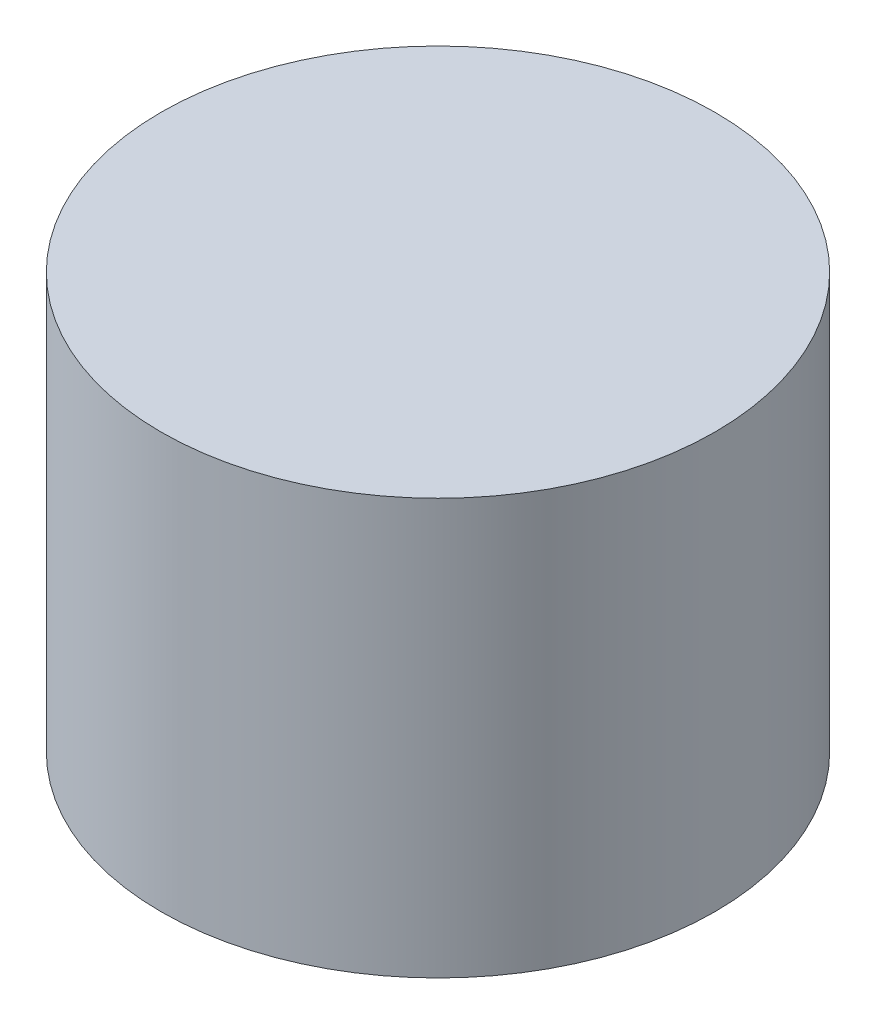
ISO-10303-21;
HEADER;
FILE_DESCRIPTION(('STEP AP214'),'2;1');
FILE_NAME('part.step','',(''),(''),'','','');
FILE_SCHEMA(('AUTOMOTIVE_DESIGN { 1 0 10303 214 1 1 1 1 }'));
ENDSEC;
DATA;
#1=APPLICATION_CONTEXT('core data for automotive mechanical design processes');
#2=APPLICATION_PROTOCOL_DEFINITION('international standard','automotive_design',2000,#1);
#3=PRODUCT_CONTEXT('',#1,'mechanical');
#4=PRODUCT('Part','Part','',(#3));
#5=PRODUCT_RELATED_PRODUCT_CATEGORY('part','',(#4));
#6=PRODUCT_DEFINITION_FORMATION('','',#4);
#7=PRODUCT_DEFINITION_CONTEXT('part definition',#1,'design');
#8=PRODUCT_DEFINITION('design','',#6,#7);
#9=PRODUCT_DEFINITION_SHAPE('','',#8);
#10=(LENGTH_UNIT() NAMED_UNIT(*) SI_UNIT(.MILLI.,.METRE.));
#11=(NAMED_UNIT(*) PLANE_ANGLE_UNIT() SI_UNIT($,.RADIAN.));
#12=(NAMED_UNIT(*) SI_UNIT($,.STERADIAN.) SOLID_ANGLE_UNIT());
#13=UNCERTAINTY_MEASURE_WITH_UNIT(LENGTH_MEASURE(1.E-05),#10,'distance_accuracy_value','');
#14=(GEOMETRIC_REPRESENTATION_CONTEXT(3) GLOBAL_UNCERTAINTY_ASSIGNED_CONTEXT((#13)) GLOBAL_UNIT_ASSIGNED_CONTEXT((#10,
#11,#12)) REPRESENTATION_CONTEXT('',''));
#15=CARTESIAN_POINT('',(0.,0.,0.));
#16=DIRECTION('',(0.,0.,1.));
#17=DIRECTION('',(1.,0.,0.));
#18=AXIS2_PLACEMENT_3D('',#15,#16,#17);
#19=CARTESIAN_POINT('',(0.,7.5,0.));
#20=DIRECTION('',(0.,-1.,0.));
#21=DIRECTION('',(0.,0.,-1.));
#22=AXIS2_PLACEMENT_3D('',#19,#20,#21);
#23=CYLINDRICAL_SURFACE('',#22,10.);
#24=CARTESIAN_POINT('',(0.,7.5,0.));
#25=DIRECTION('',(0.,1.,0.));
#26=DIRECTION('',(0.,0.,1.));
#27=AXIS2_PLACEMENT_3D('',#24,#25,#26);
#28=CIRCLE('',#27,10.);
#29=CARTESIAN_POINT('',(0.,7.5,10.));
#30=VERTEX_POINT('',#29);
#31=EDGE_CURVE('E10',#30,#30,#28,.T.);
#32=ORIENTED_EDGE('',*,*,#31,.F.);
#33=EDGE_LOOP('',(#32));
#34=FACE_BOUND('',#33,.T.);
#35=CARTESIAN_POINT('',(0.,-7.5,0.));
#36=DIRECTION('',(0.,1.,0.));
#37=DIRECTION('',(0.,0.,1.));
#38=AXIS2_PLACEMENT_3D('',#35,#36,#37);
#39=CIRCLE('',#38,10.);
#40=CARTESIAN_POINT('',(0.,-7.5,10.));
#41=VERTEX_POINT('',#40);
#42=EDGE_CURVE('E43',#41,#41,#39,.T.);
#43=ORIENTED_EDGE('',*,*,#42,.T.);
#44=EDGE_LOOP('',(#43));
#45=FACE_BOUND('',#44,.T.);
#46=ADVANCED_FACE('F40',(#34,#45),#23,.T.);
#47=CARTESIAN_POINT('',(0.,7.5,0.));
#48=DIRECTION('',(0.,1.,0.));
#49=DIRECTION('',(0.,0.,1.));
#50=AXIS2_PLACEMENT_3D('',#47,#48,#49);
#51=PLANE('',#50);
#52=ORIENTED_EDGE('',*,*,#31,.T.);
#53=EDGE_LOOP('',(#52));
#54=FACE_BOUND('',#53,.T.);
#55=ADVANCED_FACE('F73',(#54),#51,.T.);
#56=CARTESIAN_POINT('',(0.,-7.5,0.));
#57=DIRECTION('',(0.,1.,0.));
#58=DIRECTION('',(0.,0.,1.));
#59=AXIS2_PLACEMENT_3D('',#56,#57,#58);
#60=PLANE('',#59);
#61=CARTESIAN_POINT('',(0.,-7.5,0.));
#62=DIRECTION('',(0.,-1.,0.));
#63=DIRECTION('',(0.,0.,-1.));
#64=AXIS2_PLACEMENT_3D('',#61,#62,#63);
#65=CIRCLE('',#64,2.);
#66=CARTESIAN_POINT('',(0.,-7.5,-2.));
#67=VERTEX_POINT('',#66);
#68=EDGE_CURVE('E54',#67,#67,#65,.T.);
#69=ORIENTED_EDGE('',*,*,#68,.F.);
#70=EDGE_LOOP('',(#69));
#71=FACE_BOUND('',#70,.T.);
#72=ORIENTED_EDGE('',*,*,#42,.F.);
#73=EDGE_LOOP('',(#72));
#74=FACE_BOUND('',#73,.T.);
#75=ADVANCED_FACE('F67',(#71,#74),#60,.F.);
#76=CARTESIAN_POINT('',(0.,2.5,0.));
#77=DIRECTION('',(0.,-1.,0.));
#78=DIRECTION('',(0.,0.,-1.));
#79=AXIS2_PLACEMENT_3D('',#76,#77,#78);
#80=CYLINDRICAL_SURFACE('',#79,2.);
#81=CARTESIAN_POINT('',(0.,2.5,0.));
#82=DIRECTION('',(0.,-1.,0.));
#83=DIRECTION('',(0.,0.,-1.));
#84=AXIS2_PLACEMENT_3D('',#81,#82,#83);
#85=CIRCLE('',#84,2.);
#86=CARTESIAN_POINT('',(0.,2.5,-2.));
#87=VERTEX_POINT('',#86);
#88=EDGE_CURVE('E52',#87,#87,#85,.T.);
#89=ORIENTED_EDGE('',*,*,#88,.F.);
#90=EDGE_LOOP('',(#89));
#91=FACE_BOUND('',#90,.T.);
#92=ORIENTED_EDGE('',*,*,#68,.T.);
#93=EDGE_LOOP('',(#92));
#94=FACE_BOUND('',#93,.T.);
#95=ADVANCED_FACE('F64',(#91,#94),#80,.F.);
#96=CARTESIAN_POINT('',(0.,2.5,0.));
#97=DIRECTION('',(0.,-1.,0.));
#98=DIRECTION('',(0.,0.,-1.));
#99=AXIS2_PLACEMENT_3D('',#96,#97,#98);
#100=PLANE('',#99);
#101=ORIENTED_EDGE('',*,*,#88,.T.);
#102=EDGE_LOOP('',(#101));
#103=FACE_BOUND('',#102,.T.);
#104=ADVANCED_FACE('F62',(#103),#100,.T.);
#105=CLOSED_SHELL('',(#46,#55,#75,#95,#104));
#106=MANIFOLD_SOLID_BREP('B2',#105);
#107=ADVANCED_BREP_SHAPE_REPRESENTATION('',(#18,#106),#14);
#108=SHAPE_DEFINITION_REPRESENTATION(#9,#107);
ENDSEC;
END-ISO-10303-21;
